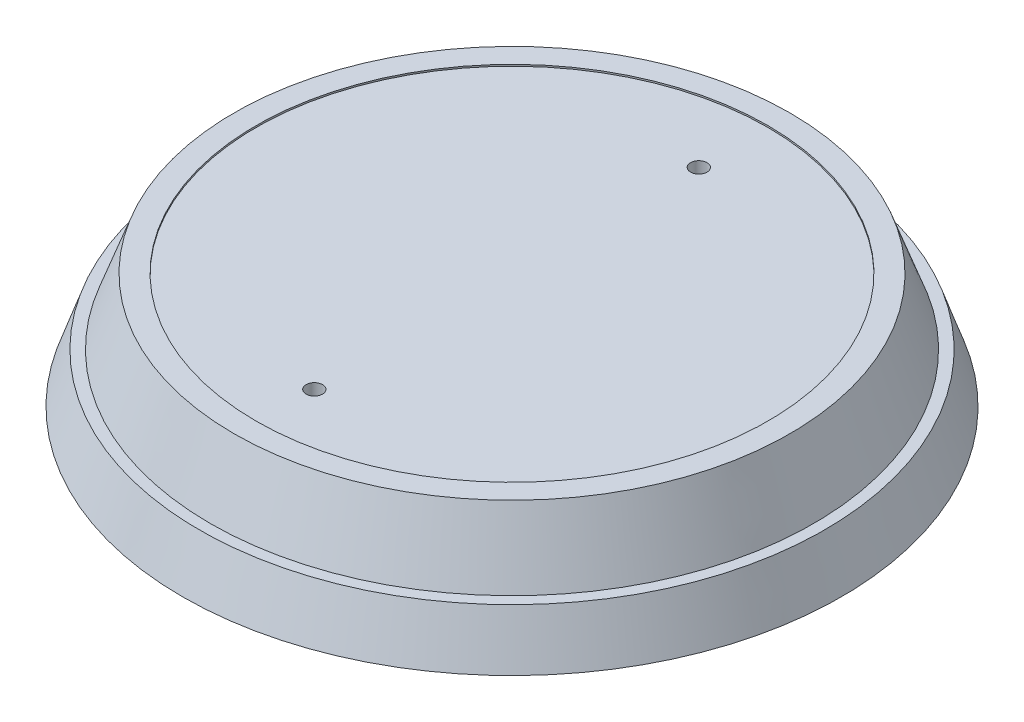
ISO-10303-21;
HEADER;
FILE_DESCRIPTION(('STEP AP214'),'2;1');
FILE_NAME('part.step','',(''),(''),'','','');
FILE_SCHEMA(('AUTOMOTIVE_DESIGN { 1 0 10303 214 1 1 1 1 }'));
ENDSEC;
DATA;
#1=APPLICATION_CONTEXT('core data for automotive mechanical design processes');
#2=APPLICATION_PROTOCOL_DEFINITION('international standard','automotive_design',2000,#1);
#3=PRODUCT_CONTEXT('',#1,'mechanical');
#4=PRODUCT('Part','Part','',(#3));
#5=PRODUCT_RELATED_PRODUCT_CATEGORY('part','',(#4));
#6=PRODUCT_DEFINITION_FORMATION('','',#4);
#7=PRODUCT_DEFINITION_CONTEXT('part definition',#1,'design');
#8=PRODUCT_DEFINITION('design','',#6,#7);
#9=PRODUCT_DEFINITION_SHAPE('','',#8);
#10=(LENGTH_UNIT() NAMED_UNIT(*) SI_UNIT(.MILLI.,.METRE.));
#11=(NAMED_UNIT(*) PLANE_ANGLE_UNIT() SI_UNIT($,.RADIAN.));
#12=(NAMED_UNIT(*) SI_UNIT($,.STERADIAN.) SOLID_ANGLE_UNIT());
#13=UNCERTAINTY_MEASURE_WITH_UNIT(LENGTH_MEASURE(1.E-05),#10,'distance_accuracy_value','');
#14=(GEOMETRIC_REPRESENTATION_CONTEXT(3) GLOBAL_UNCERTAINTY_ASSIGNED_CONTEXT((#13)) GLOBAL_UNIT_ASSIGNED_CONTEXT((#10,
#11,#12)) REPRESENTATION_CONTEXT('',''));
#15=CARTESIAN_POINT('',(0.,0.,0.));
#16=DIRECTION('',(0.,0.,1.));
#17=DIRECTION('',(1.,0.,0.));
#18=AXIS2_PLACEMENT_3D('',#15,#16,#17);
#19=CARTESIAN_POINT('',(0.,0.,0.));
#20=DIRECTION('',(0.,-1.,0.));
#21=DIRECTION('',(0.,0.,-1.));
#22=AXIS2_PLACEMENT_3D('',#19,#20,#21);
#23=PLANE('',#22);
#24=CARTESIAN_POINT('',(0.,0.,0.));
#25=DIRECTION('',(0.,-1.,0.));
#26=DIRECTION('',(0.,0.,-1.));
#27=AXIS2_PLACEMENT_3D('',#24,#25,#26);
#28=CIRCLE('',#27,15.);
#29=CARTESIAN_POINT('',(0.,0.,-15.));
#30=VERTEX_POINT('',#29);
#31=EDGE_CURVE('E43',#30,#30,#28,.T.);
#32=ORIENTED_EDGE('',*,*,#31,.T.);
#33=EDGE_LOOP('',(#32));
#34=FACE_BOUND('',#33,.T.);
#35=ADVANCED_FACE('F37',(#34),#23,.T.);
#36=CARTESIAN_POINT('',(0.,0.,0.));
#37=DIRECTION('',(0.,-1.,0.));
#38=DIRECTION('',(0.,0.,-1.));
#39=AXIS2_PLACEMENT_3D('',#36,#37,#38);
#40=CYLINDRICAL_SURFACE('',#39,15.);
#41=CARTESIAN_POINT('',(0.,-5.,0.));
#42=DIRECTION('',(0.,-1.,0.));
#43=DIRECTION('',(0.,0.,-1.));
#44=AXIS2_PLACEMENT_3D('',#41,#42,#43);
#45=CIRCLE('',#44,15.);
#46=CARTESIAN_POINT('',(0.,-5.,-15.));
#47=VERTEX_POINT('',#46);
#48=EDGE_CURVE('E47',#47,#47,#45,.T.);
#49=ORIENTED_EDGE('',*,*,#48,.T.);
#50=EDGE_LOOP('',(#49));
#51=FACE_BOUND('',#50,.T.);
#52=ORIENTED_EDGE('',*,*,#31,.F.);
#53=EDGE_LOOP('',(#52));
#54=FACE_BOUND('',#53,.T.);
#55=ADVANCED_FACE('F108',(#51,#54),#40,.F.);
#56=CARTESIAN_POINT('',(30.,-5.,0.));
#57=DIRECTION('',(0.,-1.,0.));
#58=DIRECTION('',(0.,0.,-1.));
#59=AXIS2_PLACEMENT_3D('',#56,#57,#58);
#60=PLANE('',#59);
#61=CARTESIAN_POINT('',(0.,-5.,0.));
#62=DIRECTION('',(0.,-1.,0.));
#63=DIRECTION('',(0.,0.,-1.));
#64=AXIS2_PLACEMENT_3D('',#61,#62,#63);
#65=CIRCLE('',#64,30.);
#66=CARTESIAN_POINT('',(0.,-5.,-30.));
#67=VERTEX_POINT('',#66);
#68=EDGE_CURVE('E51',#67,#67,#65,.T.);
#69=ORIENTED_EDGE('',*,*,#68,.T.);
#70=EDGE_LOOP('',(#69));
#71=FACE_BOUND('',#70,.T.);
#72=ORIENTED_EDGE('',*,*,#48,.F.);
#73=EDGE_LOOP('',(#72));
#74=FACE_BOUND('',#73,.T.);
#75=ADVANCED_FACE('F112',(#71,#74),#60,.T.);
#76=CARTESIAN_POINT('',(0.,-5.,0.));
#77=DIRECTION('',(0.,-1.,0.));
#78=DIRECTION('',(0.,0.,-1.));
#79=AXIS2_PLACEMENT_3D('',#76,#77,#78);
#80=CONICAL_SURFACE('',#79,30.,0.329944111538507);
#81=CARTESIAN_POINT('',(0.,-0.499114755805476,0.));
#82=DIRECTION('',(0.,-1.,0.));
#83=DIRECTION('',(0.,0.,-1.));
#84=AXIS2_PLACEMENT_3D('',#81,#82,#83);
#85=CIRCLE('',#84,28.4586159325211);
#86=CARTESIAN_POINT('',(0.,-0.499114755805476,-28.4586159325211));
#87=VERTEX_POINT('',#86);
#88=EDGE_CURVE('E56',#87,#87,#85,.T.);
#89=ORIENTED_EDGE('',*,*,#88,.T.);
#90=EDGE_LOOP('',(#89));
#91=FACE_BOUND('',#90,.T.);
#92=ORIENTED_EDGE('',*,*,#68,.F.);
#93=EDGE_LOOP('',(#92));
#94=FACE_BOUND('',#93,.T.);
#95=ADVANCED_FACE('F117',(#91,#94),#80,.T.);
#96=CARTESIAN_POINT('',(27.4586159325211,-0.499114755805476,0.));
#97=DIRECTION('',(0.,1.,0.));
#98=DIRECTION('',(0.,0.,1.));
#99=AXIS2_PLACEMENT_3D('',#96,#97,#98);
#100=PLANE('',#99);
#101=CARTESIAN_POINT('',(0.,-0.499114755805476,0.));
#102=DIRECTION('',(0.,-1.,0.));
#103=DIRECTION('',(0.,0.,-1.));
#104=AXIS2_PLACEMENT_3D('',#101,#102,#103);
#105=CIRCLE('',#104,27.4586159325211);
#106=CARTESIAN_POINT('',(0.,-0.499114755805476,-27.4586159325211));
#107=VERTEX_POINT('',#106);
#108=EDGE_CURVE('E59',#107,#107,#105,.T.);
#109=ORIENTED_EDGE('',*,*,#108,.T.);
#110=EDGE_LOOP('',(#109));
#111=FACE_BOUND('',#110,.T.);
#112=ORIENTED_EDGE('',*,*,#88,.F.);
#113=EDGE_LOOP('',(#112));
#114=FACE_BOUND('',#113,.T.);
#115=ADVANCED_FACE('F124',(#111,#114),#100,.T.);
#116=CARTESIAN_POINT('',(0.,-0.499114755805476,0.));
#117=DIRECTION('',(0.,-1.,0.));
#118=DIRECTION('',(0.,0.,-1.));
#119=AXIS2_PLACEMENT_3D('',#116,#117,#118);
#120=CONICAL_SURFACE('',#119,27.4586159325211,0.345351353536931);
#121=CARTESIAN_POINT('',(0.,5.50088524419452,0.));
#122=DIRECTION('',(0.,-1.,0.));
#123=DIRECTION('',(0.,0.,-1.));
#124=AXIS2_PLACEMENT_3D('',#121,#122,#123);
#125=CIRCLE('',#124,25.3);
#126=CARTESIAN_POINT('',(0.,5.50088524419452,-25.3));
#127=VERTEX_POINT('',#126);
#128=EDGE_CURVE('E62',#127,#127,#125,.T.);
#129=ORIENTED_EDGE('',*,*,#128,.T.);
#130=EDGE_LOOP('',(#129));
#131=FACE_BOUND('',#130,.T.);
#132=ORIENTED_EDGE('',*,*,#108,.F.);
#133=EDGE_LOOP('',(#132));
#134=FACE_BOUND('',#133,.T.);
#135=ADVANCED_FACE('F128',(#131,#134),#120,.T.);
#136=CARTESIAN_POINT('',(23.3,5.50088524419452,0.));
#137=DIRECTION('',(0.,1.,0.));
#138=DIRECTION('',(0.,0.,1.));
#139=AXIS2_PLACEMENT_3D('',#136,#137,#138);
#140=PLANE('',#139);
#141=CARTESIAN_POINT('',(0.,5.50088524419452,0.));
#142=DIRECTION('',(0.,-1.,0.));
#143=DIRECTION('',(0.,0.,-1.));
#144=AXIS2_PLACEMENT_3D('',#141,#142,#143);
#145=CIRCLE('',#144,23.3);
#146=CARTESIAN_POINT('',(0.,5.50088524419452,-23.3));
#147=VERTEX_POINT('',#146);
#148=EDGE_CURVE('E65',#147,#147,#145,.T.);
#149=ORIENTED_EDGE('',*,*,#148,.T.);
#150=EDGE_LOOP('',(#149));
#151=FACE_BOUND('',#150,.T.);
#152=ORIENTED_EDGE('',*,*,#128,.F.);
#153=EDGE_LOOP('',(#152));
#154=FACE_BOUND('',#153,.T.);
#155=ADVANCED_FACE('F132',(#151,#154),#140,.T.);
#156=CARTESIAN_POINT('',(0.,0.,0.));
#157=DIRECTION('',(0.,-1.,0.));
#158=DIRECTION('',(0.,0.,-1.));
#159=AXIS2_PLACEMENT_3D('',#156,#157,#158);
#160=CYLINDRICAL_SURFACE('',#159,23.3);
#161=CARTESIAN_POINT('',(0.,5.35088524419453,0.));
#162=DIRECTION('',(0.,1.,0.));
#163=DIRECTION('',(0.,0.,1.));
#164=AXIS2_PLACEMENT_3D('',#161,#162,#163);
#165=CIRCLE('',#164,23.3);
#166=CARTESIAN_POINT('',(0.,5.35088524419453,23.3));
#167=VERTEX_POINT('',#166);
#168=EDGE_CURVE('E10',#167,#167,#165,.T.);
#169=ORIENTED_EDGE('',*,*,#168,.F.);
#170=EDGE_LOOP('',(#169));
#171=FACE_BOUND('',#170,.T.);
#172=ORIENTED_EDGE('',*,*,#148,.F.);
#173=EDGE_LOOP('',(#172));
#174=FACE_BOUND('',#173,.T.);
#175=ADVANCED_FACE('F94',(#171,#174),#160,.F.);
#176=CARTESIAN_POINT('',(0.,5.35088524419453,0.));
#177=DIRECTION('',(0.,1.,0.));
#178=DIRECTION('',(0.,0.,1.));
#179=AXIS2_PLACEMENT_3D('',#176,#177,#178);
#180=PLANE('',#179);
#181=CARTESIAN_POINT('',(0.,5.35088524419453,-17.0047346315388));
#182=DIRECTION('',(0.,1.,0.));
#183=DIRECTION('',(0.,0.,1.));
#184=AXIS2_PLACEMENT_3D('',#181,#182,#183);
#185=CIRCLE('',#184,0.75);
#186=CARTESIAN_POINT('',(0.,5.35088524419453,-16.2547346315388));
#187=VERTEX_POINT('',#186);
#188=EDGE_CURVE('E75',#187,#187,#185,.T.);
#189=ORIENTED_EDGE('',*,*,#188,.F.);
#190=EDGE_LOOP('',(#189));
#191=FACE_BOUND('',#190,.T.);
#192=CARTESIAN_POINT('',(0.,5.35088524419453,17.9952653684612));
#193=DIRECTION('',(0.,1.,0.));
#194=DIRECTION('',(0.,0.,1.));
#195=AXIS2_PLACEMENT_3D('',#192,#193,#194);
#196=CIRCLE('',#195,0.75);
#197=CARTESIAN_POINT('',(0.,5.35088524419453,18.7452653684612));
#198=VERTEX_POINT('',#197);
#199=EDGE_CURVE('E72',#198,#198,#196,.T.);
#200=ORIENTED_EDGE('',*,*,#199,.F.);
#201=EDGE_LOOP('',(#200));
#202=FACE_BOUND('',#201,.T.);
#203=ORIENTED_EDGE('',*,*,#168,.T.);
#204=EDGE_LOOP('',(#203));
#205=FACE_BOUND('',#204,.T.);
#206=ADVANCED_FACE('F90',(#191,#202,#205),#180,.T.);
#207=CARTESIAN_POINT('',(0.,0.350885244194525,17.9952653684612));
#208=DIRECTION('',(0.,1.,0.));
#209=DIRECTION('',(0.,0.,1.));
#210=AXIS2_PLACEMENT_3D('',#207,#208,#209);
#211=CYLINDRICAL_SURFACE('',#210,0.75);
#212=CARTESIAN_POINT('',(0.,0.350885244194525,17.9952653684612));
#213=DIRECTION('',(0.,1.,0.));
#214=DIRECTION('',(0.,0.,1.));
#215=AXIS2_PLACEMENT_3D('',#212,#213,#214);
#216=CIRCLE('',#215,0.75);
#217=CARTESIAN_POINT('',(0.,0.350885244194525,18.7452653684612));
#218=VERTEX_POINT('',#217);
#219=EDGE_CURVE('E69',#218,#218,#216,.T.);
#220=ORIENTED_EDGE('',*,*,#219,.F.);
#221=EDGE_LOOP('',(#220));
#222=FACE_BOUND('',#221,.T.);
#223=ORIENTED_EDGE('',*,*,#199,.T.);
#224=EDGE_LOOP('',(#223));
#225=FACE_BOUND('',#224,.T.);
#226=ADVANCED_FACE('F93',(#222,#225),#211,.F.);
#227=CARTESIAN_POINT('',(0.,0.350885244194525,17.9952653684612));
#228=DIRECTION('',(0.,1.,0.));
#229=DIRECTION('',(0.,0.,1.));
#230=AXIS2_PLACEMENT_3D('',#227,#228,#229);
#231=PLANE('',#230);
#232=ORIENTED_EDGE('',*,*,#219,.T.);
#233=EDGE_LOOP('',(#232));
#234=FACE_BOUND('',#233,.T.);
#235=ADVANCED_FACE('F86',(#234),#231,.T.);
#236=CARTESIAN_POINT('',(0.,0.350885244194525,-17.0047346315388));
#237=DIRECTION('',(0.,1.,0.));
#238=DIRECTION('',(0.,0.,1.));
#239=AXIS2_PLACEMENT_3D('',#236,#237,#238);
#240=CYLINDRICAL_SURFACE('',#239,0.75);
#241=CARTESIAN_POINT('',(0.,0.350885244194525,-17.0047346315388));
#242=DIRECTION('',(0.,1.,0.));
#243=DIRECTION('',(0.,0.,1.));
#244=AXIS2_PLACEMENT_3D('',#241,#242,#243);
#245=CIRCLE('',#244,0.75);
#246=CARTESIAN_POINT('',(0.,0.350885244194525,-16.2547346315388));
#247=VERTEX_POINT('',#246);
#248=EDGE_CURVE('E68',#247,#247,#245,.T.);
#249=ORIENTED_EDGE('',*,*,#248,.F.);
#250=EDGE_LOOP('',(#249));
#251=FACE_BOUND('',#250,.T.);
#252=ORIENTED_EDGE('',*,*,#188,.T.);
#253=EDGE_LOOP('',(#252));
#254=FACE_BOUND('',#253,.T.);
#255=ADVANCED_FACE('F83',(#251,#254),#240,.F.);
#256=CARTESIAN_POINT('',(0.,0.350885244194525,-17.0047346315388));
#257=DIRECTION('',(0.,1.,0.));
#258=DIRECTION('',(0.,0.,1.));
#259=AXIS2_PLACEMENT_3D('',#256,#257,#258);
#260=PLANE('',#259);
#261=ORIENTED_EDGE('',*,*,#248,.T.);
#262=EDGE_LOOP('',(#261));
#263=FACE_BOUND('',#262,.T.);
#264=ADVANCED_FACE('F81',(#263),#260,.T.);
#265=CLOSED_SHELL('',(#35,#55,#75,#95,#115,#135,#155,#175,#206,#226,#235,#255,#264));
#266=MANIFOLD_SOLID_BREP('B2',#265);
#267=ADVANCED_BREP_SHAPE_REPRESENTATION('',(#18,#266),#14);
#268=SHAPE_DEFINITION_REPRESENTATION(#9,#267);
ENDSEC;
END-ISO-10303-21;
